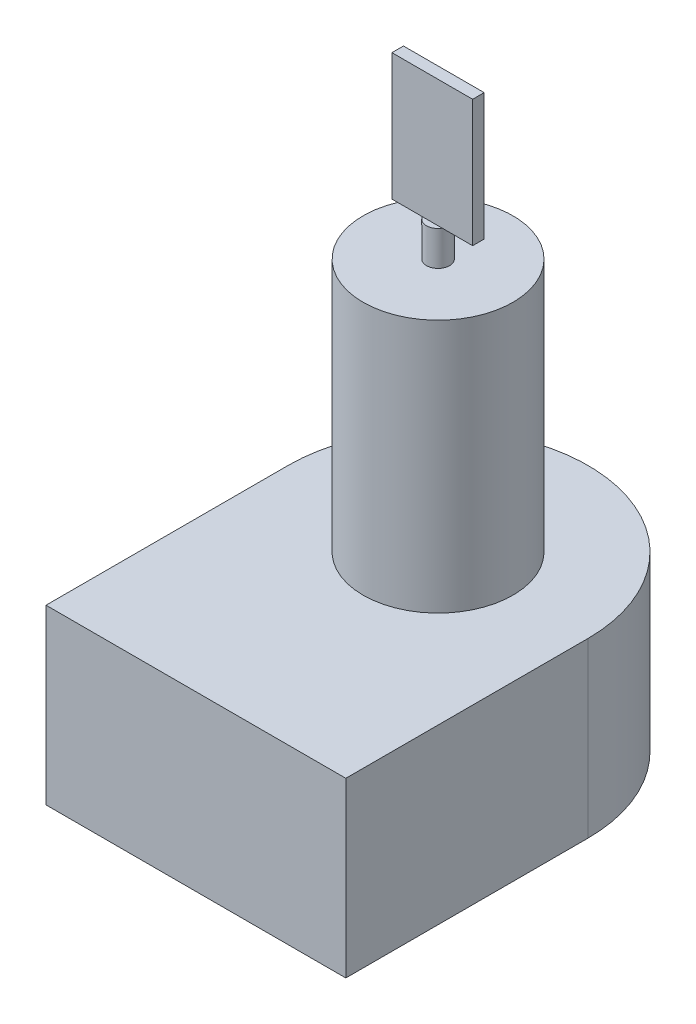
ISO-10303-21;
HEADER;
FILE_DESCRIPTION(('STEP AP214'),'2;1');
FILE_NAME('part.step','',(''),(''),'','','');
FILE_SCHEMA(('AUTOMOTIVE_DESIGN { 1 0 10303 214 1 1 1 1 }'));
ENDSEC;
DATA;
#1=APPLICATION_CONTEXT('core data for automotive mechanical design processes');
#2=APPLICATION_PROTOCOL_DEFINITION('international standard','automotive_design',2000,#1);
#3=PRODUCT_CONTEXT('',#1,'mechanical');
#4=PRODUCT('Part','Part','',(#3));
#5=PRODUCT_RELATED_PRODUCT_CATEGORY('part','',(#4));
#6=PRODUCT_DEFINITION_FORMATION('','',#4);
#7=PRODUCT_DEFINITION_CONTEXT('part definition',#1,'design');
#8=PRODUCT_DEFINITION('design','',#6,#7);
#9=PRODUCT_DEFINITION_SHAPE('','',#8);
#10=(LENGTH_UNIT() NAMED_UNIT(*) SI_UNIT(.MILLI.,.METRE.));
#11=(NAMED_UNIT(*) PLANE_ANGLE_UNIT() SI_UNIT($,.RADIAN.));
#12=(NAMED_UNIT(*) SI_UNIT($,.STERADIAN.) SOLID_ANGLE_UNIT());
#13=UNCERTAINTY_MEASURE_WITH_UNIT(LENGTH_MEASURE(1.E-05),#10,'distance_accuracy_value','');
#14=(GEOMETRIC_REPRESENTATION_CONTEXT(3) GLOBAL_UNCERTAINTY_ASSIGNED_CONTEXT((#13)) GLOBAL_UNIT_ASSIGNED_CONTEXT((#10,
#11,#12)) REPRESENTATION_CONTEXT('',''));
#15=CARTESIAN_POINT('',(0.,0.,0.));
#16=DIRECTION('',(0.,0.,1.));
#17=DIRECTION('',(1.,0.,0.));
#18=AXIS2_PLACEMENT_3D('',#15,#16,#17);
#19=CARTESIAN_POINT('',(0.,40.,0.));
#20=DIRECTION('',(0.,1.,0.));
#21=DIRECTION('',(0.,0.,1.));
#22=AXIS2_PLACEMENT_3D('',#19,#20,#21);
#23=PLANE('',#22);
#24=DIRECTION('',(1.,0.,0.));
#25=VECTOR('',#24,1.);
#26=CARTESIAN_POINT('',(-3.5,40.,0.5));
#27=LINE('',#26,#25);
#28=CARTESIAN_POINT('',(-0.866025403784439,40.,0.5));
#29=VERTEX_POINT('',#28);
#30=CARTESIAN_POINT('',(0.866025403784439,40.,0.5));
#31=VERTEX_POINT('',#30);
#32=EDGE_CURVE('E11',#29,#31,#27,.T.);
#33=ORIENTED_EDGE('',*,*,#32,.F.);
#34=CARTESIAN_POINT('',(0.,40.,0.));
#35=DIRECTION('',(0.,1.,0.));
#36=DIRECTION('',(0.,0.,1.));
#37=AXIS2_PLACEMENT_3D('',#34,#35,#36);
#38=CIRCLE('',#37,1.);
#39=EDGE_CURVE('E141',#29,#31,#38,.T.);
#40=ORIENTED_EDGE('',*,*,#39,.T.);
#41=EDGE_LOOP('',(#33,#40));
#42=FACE_BOUND('',#41,.T.);
#43=ADVANCED_FACE('F38',(#42),#23,.T.);
#44=CARTESIAN_POINT('',(0.,15.,0.));
#45=DIRECTION('',(0.,-1.,0.));
#46=DIRECTION('',(0.,0.,-1.));
#47=AXIS2_PLACEMENT_3D('',#44,#45,#46);
#48=CYLINDRICAL_SURFACE('',#47,13.);
#49=CARTESIAN_POINT('',(0.,0.,0.));
#50=DIRECTION('',(0.,1.,0.));
#51=DIRECTION('',(0.,0.,1.));
#52=AXIS2_PLACEMENT_3D('',#49,#50,#51);
#53=CIRCLE('',#52,13.);
#54=CARTESIAN_POINT('',(13.,0.,0.));
#55=VERTEX_POINT('',#54);
#56=CARTESIAN_POINT('',(-13.,0.,0.));
#57=VERTEX_POINT('',#56);
#58=EDGE_CURVE('E159',#55,#57,#53,.T.);
#59=ORIENTED_EDGE('',*,*,#58,.T.);
#60=DIRECTION('',(0.,-1.,0.));
#61=VECTOR('',#60,1.);
#62=CARTESIAN_POINT('',(-13.,15.,0.));
#63=LINE('',#62,#61);
#64=CARTESIAN_POINT('',(-13.,15.,0.));
#65=VERTEX_POINT('',#64);
#66=EDGE_CURVE('E42',#65,#57,#63,.T.);
#67=ORIENTED_EDGE('',*,*,#66,.F.);
#68=CARTESIAN_POINT('',(0.,15.,0.));
#69=DIRECTION('',(0.,1.,0.));
#70=DIRECTION('',(0.,0.,1.));
#71=AXIS2_PLACEMENT_3D('',#68,#69,#70);
#72=CIRCLE('',#71,13.);
#73=CARTESIAN_POINT('',(13.,15.,0.));
#74=VERTEX_POINT('',#73);
#75=EDGE_CURVE('E162',#74,#65,#72,.T.);
#76=ORIENTED_EDGE('',*,*,#75,.F.);
#77=DIRECTION('',(0.,-1.,0.));
#78=VECTOR('',#77,1.);
#79=CARTESIAN_POINT('',(13.,15.,0.));
#80=LINE('',#79,#78);
#81=EDGE_CURVE('E172',#74,#55,#80,.T.);
#82=ORIENTED_EDGE('',*,*,#81,.T.);
#83=EDGE_LOOP('',(#59,#67,#76,#82));
#84=FACE_BOUND('',#83,.T.);
#85=ADVANCED_FACE('F40',(#84),#48,.T.);
#86=CARTESIAN_POINT('',(-13.,15.,0.));
#87=DIRECTION('',(1.,0.,0.));
#88=DIRECTION('',(0.,0.,-1.));
#89=AXIS2_PLACEMENT_3D('',#86,#87,#88);
#90=PLANE('',#89);
#91=DIRECTION('',(0.,0.,1.));
#92=VECTOR('',#91,1.);
#93=CARTESIAN_POINT('',(-13.,0.,0.));
#94=LINE('',#93,#92);
#95=CARTESIAN_POINT('',(-13.,0.,21.));
#96=VERTEX_POINT('',#95);
#97=EDGE_CURVE('E175',#57,#96,#94,.T.);
#98=ORIENTED_EDGE('',*,*,#97,.T.);
#99=DIRECTION('',(0.,-1.,0.));
#100=VECTOR('',#99,1.);
#101=CARTESIAN_POINT('',(-13.,15.,21.));
#102=LINE('',#101,#100);
#103=CARTESIAN_POINT('',(-13.,15.,21.));
#104=VERTEX_POINT('',#103);
#105=EDGE_CURVE('E184',#104,#96,#102,.T.);
#106=ORIENTED_EDGE('',*,*,#105,.F.);
#107=DIRECTION('',(0.,0.,1.));
#108=VECTOR('',#107,1.);
#109=CARTESIAN_POINT('',(-13.,15.,0.));
#110=LINE('',#109,#108);
#111=EDGE_CURVE('E165',#65,#104,#110,.T.);
#112=ORIENTED_EDGE('',*,*,#111,.F.);
#113=ORIENTED_EDGE('',*,*,#66,.T.);
#114=EDGE_LOOP('',(#98,#106,#112,#113));
#115=FACE_BOUND('',#114,.T.);
#116=ADVANCED_FACE('F193',(#115),#90,.F.);
#117=CARTESIAN_POINT('',(-13.,15.,21.));
#118=DIRECTION('',(0.,0.,-1.));
#119=DIRECTION('',(-1.,0.,0.));
#120=AXIS2_PLACEMENT_3D('',#117,#118,#119);
#121=PLANE('',#120);
#122=DIRECTION('',(1.,0.,0.));
#123=VECTOR('',#122,1.);
#124=CARTESIAN_POINT('',(-13.,0.,21.));
#125=LINE('',#124,#123);
#126=CARTESIAN_POINT('',(13.,0.,21.));
#127=VERTEX_POINT('',#126);
#128=EDGE_CURVE('E177',#96,#127,#125,.T.);
#129=ORIENTED_EDGE('',*,*,#128,.T.);
#130=DIRECTION('',(0.,-1.,0.));
#131=VECTOR('',#130,1.);
#132=CARTESIAN_POINT('',(13.,15.,21.));
#133=LINE('',#132,#131);
#134=CARTESIAN_POINT('',(13.,15.,21.));
#135=VERTEX_POINT('',#134);
#136=EDGE_CURVE('E182',#135,#127,#133,.T.);
#137=ORIENTED_EDGE('',*,*,#136,.F.);
#138=DIRECTION('',(1.,0.,0.));
#139=VECTOR('',#138,1.);
#140=CARTESIAN_POINT('',(-13.,15.,21.));
#141=LINE('',#140,#139);
#142=EDGE_CURVE('E168',#104,#135,#141,.T.);
#143=ORIENTED_EDGE('',*,*,#142,.F.);
#144=ORIENTED_EDGE('',*,*,#105,.T.);
#145=EDGE_LOOP('',(#129,#137,#143,#144));
#146=FACE_BOUND('',#145,.T.);
#147=ADVANCED_FACE('F202',(#146),#121,.F.);
#148=CARTESIAN_POINT('',(13.,15.,21.));
#149=DIRECTION('',(-1.,0.,0.));
#150=DIRECTION('',(0.,0.,1.));
#151=AXIS2_PLACEMENT_3D('',#148,#149,#150);
#152=PLANE('',#151);
#153=DIRECTION('',(0.,0.,-1.));
#154=VECTOR('',#153,1.);
#155=CARTESIAN_POINT('',(13.,0.,21.));
#156=LINE('',#155,#154);
#157=EDGE_CURVE('E166',#127,#55,#156,.T.);
#158=ORIENTED_EDGE('',*,*,#157,.T.);
#159=ORIENTED_EDGE('',*,*,#81,.F.);
#160=DIRECTION('',(0.,0.,-1.));
#161=VECTOR('',#160,1.);
#162=CARTESIAN_POINT('',(13.,15.,21.));
#163=LINE('',#162,#161);
#164=EDGE_CURVE('E170',#135,#74,#163,.T.);
#165=ORIENTED_EDGE('',*,*,#164,.F.);
#166=ORIENTED_EDGE('',*,*,#136,.T.);
#167=EDGE_LOOP('',(#158,#159,#165,#166));
#168=FACE_BOUND('',#167,.T.);
#169=ADVANCED_FACE('F205',(#168),#152,.F.);
#170=CARTESIAN_POINT('',(0.,15.,0.));
#171=DIRECTION('',(0.,1.,0.));
#172=DIRECTION('',(0.,0.,1.));
#173=AXIS2_PLACEMENT_3D('',#170,#171,#172);
#174=PLANE('',#173);
#175=CARTESIAN_POINT('',(0.,15.,0.));
#176=DIRECTION('',(0.,1.,0.));
#177=DIRECTION('',(0.,0.,1.));
#178=AXIS2_PLACEMENT_3D('',#175,#176,#177);
#179=CIRCLE('',#178,6.5);
#180=CARTESIAN_POINT('',(0.,15.,6.5));
#181=VERTEX_POINT('',#180);
#182=EDGE_CURVE('E156',#181,#181,#179,.T.);
#183=ORIENTED_EDGE('',*,*,#182,.F.);
#184=EDGE_LOOP('',(#183));
#185=FACE_BOUND('',#184,.T.);
#186=ORIENTED_EDGE('',*,*,#75,.T.);
#187=ORIENTED_EDGE('',*,*,#111,.T.);
#188=ORIENTED_EDGE('',*,*,#142,.T.);
#189=ORIENTED_EDGE('',*,*,#164,.T.);
#190=EDGE_LOOP('',(#186,#187,#188,#189));
#191=FACE_BOUND('',#190,.T.);
#192=ADVANCED_FACE('F207',(#185,#191),#174,.T.);
#193=CARTESIAN_POINT('',(0.,0.,0.));
#194=DIRECTION('',(0.,1.,0.));
#195=DIRECTION('',(0.,0.,1.));
#196=AXIS2_PLACEMENT_3D('',#193,#194,#195);
#197=PLANE('',#196);
#198=ORIENTED_EDGE('',*,*,#58,.F.);
#199=ORIENTED_EDGE('',*,*,#157,.F.);
#200=ORIENTED_EDGE('',*,*,#128,.F.);
#201=ORIENTED_EDGE('',*,*,#97,.F.);
#202=EDGE_LOOP('',(#198,#199,#200,#201));
#203=FACE_BOUND('',#202,.T.);
#204=ADVANCED_FACE('F200',(#203),#197,.F.);
#205=CARTESIAN_POINT('',(0.,37.,0.));
#206=DIRECTION('',(0.,-1.,0.));
#207=DIRECTION('',(0.,0.,-1.));
#208=AXIS2_PLACEMENT_3D('',#205,#206,#207);
#209=CYLINDRICAL_SURFACE('',#208,6.5);
#210=CARTESIAN_POINT('',(0.,37.,0.));
#211=DIRECTION('',(0.,1.,0.));
#212=DIRECTION('',(0.,0.,1.));
#213=AXIS2_PLACEMENT_3D('',#210,#211,#212);
#214=CIRCLE('',#213,6.5);
#215=CARTESIAN_POINT('',(0.,37.,6.5));
#216=VERTEX_POINT('',#215);
#217=EDGE_CURVE('E151',#216,#216,#214,.T.);
#218=ORIENTED_EDGE('',*,*,#217,.F.);
#219=EDGE_LOOP('',(#218));
#220=FACE_BOUND('',#219,.T.);
#221=ORIENTED_EDGE('',*,*,#182,.T.);
#222=EDGE_LOOP('',(#221));
#223=FACE_BOUND('',#222,.T.);
#224=ADVANCED_FACE('F215',(#220,#223),#209,.T.);
#225=CARTESIAN_POINT('',(0.,37.,0.));
#226=DIRECTION('',(0.,1.,0.));
#227=DIRECTION('',(0.,0.,1.));
#228=AXIS2_PLACEMENT_3D('',#225,#226,#227);
#229=PLANE('',#228);
#230=CARTESIAN_POINT('',(0.,37.,0.));
#231=DIRECTION('',(0.,1.,0.));
#232=DIRECTION('',(0.,0.,1.));
#233=AXIS2_PLACEMENT_3D('',#230,#231,#232);
#234=CIRCLE('',#233,1.);
#235=CARTESIAN_POINT('',(0.,37.,1.));
#236=VERTEX_POINT('',#235);
#237=EDGE_CURVE('E153',#236,#236,#234,.T.);
#238=ORIENTED_EDGE('',*,*,#237,.F.);
#239=EDGE_LOOP('',(#238));
#240=FACE_BOUND('',#239,.T.);
#241=ORIENTED_EDGE('',*,*,#217,.T.);
#242=EDGE_LOOP('',(#241));
#243=FACE_BOUND('',#242,.T.);
#244=ADVANCED_FACE('F238',(#240,#243),#229,.T.);
#245=CARTESIAN_POINT('',(0.,40.,0.));
#246=DIRECTION('',(0.,-1.,0.));
#247=DIRECTION('',(0.,0.,-1.));
#248=AXIS2_PLACEMENT_3D('',#245,#246,#247);
#249=CYLINDRICAL_SURFACE('',#248,1.);
#250=CARTESIAN_POINT('',(0.866025403784439,40.,-0.5));
#251=VERTEX_POINT('',#250);
#252=EDGE_CURVE('E145',#31,#251,#38,.T.);
#253=ORIENTED_EDGE('',*,*,#252,.F.);
#254=ORIENTED_EDGE('',*,*,#39,.F.);
#255=CARTESIAN_POINT('',(-0.866025403784439,40.,-0.5));
#256=VERTEX_POINT('',#255);
#257=EDGE_CURVE('E143',#256,#29,#38,.T.);
#258=ORIENTED_EDGE('',*,*,#257,.F.);
#259=EDGE_CURVE('E152',#251,#256,#38,.T.);
#260=ORIENTED_EDGE('',*,*,#259,.F.);
#261=EDGE_LOOP('',(#253,#254,#258,#260));
#262=FACE_BOUND('',#261,.T.);
#263=ORIENTED_EDGE('',*,*,#237,.T.);
#264=EDGE_LOOP('',(#263));
#265=FACE_BOUND('',#264,.T.);
#266=ADVANCED_FACE('F230',(#262,#265),#249,.T.);
#267=DIRECTION('',(-1.,0.,0.));
#268=VECTOR('',#267,1.);
#269=CARTESIAN_POINT('',(-3.5,40.,-0.5));
#270=LINE('',#269,#268);
#271=EDGE_CURVE('E47',#251,#256,#270,.T.);
#272=ORIENTED_EDGE('',*,*,#271,.F.);
#273=ORIENTED_EDGE('',*,*,#259,.T.);
#274=EDGE_LOOP('',(#272,#273));
#275=FACE_BOUND('',#274,.T.);
#276=ADVANCED_FACE('F222',(#275),#23,.T.);
#277=CARTESIAN_POINT('',(0.,40.,0.));
#278=DIRECTION('',(0.,1.,0.));
#279=DIRECTION('',(0.,0.,1.));
#280=AXIS2_PLACEMENT_3D('',#277,#278,#279);
#281=PLANE('',#280);
#282=CARTESIAN_POINT('',(3.5,40.,0.5));
#283=VERTEX_POINT('',#282);
#284=EDGE_CURVE('E50',#31,#283,#27,.T.);
#285=ORIENTED_EDGE('',*,*,#284,.F.);
#286=ORIENTED_EDGE('',*,*,#252,.T.);
#287=CARTESIAN_POINT('',(3.5,40.,-0.5));
#288=VERTEX_POINT('',#287);
#289=EDGE_CURVE('E348',#288,#251,#270,.T.);
#290=ORIENTED_EDGE('',*,*,#289,.F.);
#291=DIRECTION('',(0.,0.,-1.));
#292=VECTOR('',#291,1.);
#293=CARTESIAN_POINT('',(3.5,40.,-0.5));
#294=LINE('',#293,#292);
#295=EDGE_CURVE('E140',#283,#288,#294,.T.);
#296=ORIENTED_EDGE('',*,*,#295,.F.);
#297=EDGE_LOOP('',(#285,#286,#290,#296));
#298=FACE_BOUND('',#297,.T.);
#299=ADVANCED_FACE('F229',(#298),#281,.F.);
#300=CARTESIAN_POINT('',(-3.5,40.,-0.5));
#301=VERTEX_POINT('',#300);
#302=EDGE_CURVE('E347',#256,#301,#270,.T.);
#303=ORIENTED_EDGE('',*,*,#302,.F.);
#304=ORIENTED_EDGE('',*,*,#257,.T.);
#305=CARTESIAN_POINT('',(-3.5,40.,0.5));
#306=VERTEX_POINT('',#305);
#307=EDGE_CURVE('E49',#306,#29,#27,.T.);
#308=ORIENTED_EDGE('',*,*,#307,.F.);
#309=DIRECTION('',(0.,0.,1.));
#310=VECTOR('',#309,1.);
#311=CARTESIAN_POINT('',(-3.5,40.,-0.5));
#312=LINE('',#311,#310);
#313=EDGE_CURVE('E339',#301,#306,#312,.T.);
#314=ORIENTED_EDGE('',*,*,#313,.F.);
#315=EDGE_LOOP('',(#303,#304,#308,#314));
#316=FACE_BOUND('',#315,.T.);
#317=ADVANCED_FACE('F235',(#316),#281,.F.);
#318=CARTESIAN_POINT('',(3.5,51.,-0.5));
#319=DIRECTION('',(-1.,0.,0.));
#320=DIRECTION('',(0.,0.,1.));
#321=AXIS2_PLACEMENT_3D('',#318,#319,#320);
#322=PLANE('',#321);
#323=ORIENTED_EDGE('',*,*,#295,.T.);
#324=DIRECTION('',(0.,-1.,0.));
#325=VECTOR('',#324,1.);
#326=CARTESIAN_POINT('',(3.5,51.,-0.5));
#327=LINE('',#326,#325);
#328=CARTESIAN_POINT('',(3.5,51.,-0.5));
#329=VERTEX_POINT('',#328);
#330=EDGE_CURVE('E121',#329,#288,#327,.T.);
#331=ORIENTED_EDGE('',*,*,#330,.F.);
#332=DIRECTION('',(0.,0.,-1.));
#333=VECTOR('',#332,1.);
#334=CARTESIAN_POINT('',(3.5,51.,-0.5));
#335=LINE('',#334,#333);
#336=CARTESIAN_POINT('',(3.5,51.,0.5));
#337=VERTEX_POINT('',#336);
#338=EDGE_CURVE('E128',#337,#329,#335,.T.);
#339=ORIENTED_EDGE('',*,*,#338,.F.);
#340=DIRECTION('',(0.,-1.,0.));
#341=VECTOR('',#340,1.);
#342=CARTESIAN_POINT('',(3.5,51.,0.5));
#343=LINE('',#342,#341);
#344=EDGE_CURVE('E343',#337,#283,#343,.T.);
#345=ORIENTED_EDGE('',*,*,#344,.T.);
#346=EDGE_LOOP('',(#323,#331,#339,#345));
#347=FACE_BOUND('',#346,.T.);
#348=ADVANCED_FACE('F138',(#347),#322,.F.);
#349=CARTESIAN_POINT('',(-3.5,51.,-0.5));
#350=DIRECTION('',(0.,0.,1.));
#351=DIRECTION('',(1.,0.,0.));
#352=AXIS2_PLACEMENT_3D('',#349,#350,#351);
#353=PLANE('',#352);
#354=ORIENTED_EDGE('',*,*,#289,.T.);
#355=ORIENTED_EDGE('',*,*,#271,.T.);
#356=ORIENTED_EDGE('',*,*,#302,.T.);
#357=DIRECTION('',(0.,-1.,0.));
#358=VECTOR('',#357,1.);
#359=CARTESIAN_POINT('',(-3.5,51.,-0.5));
#360=LINE('',#359,#358);
#361=CARTESIAN_POINT('',(-3.5,51.,-0.5));
#362=VERTEX_POINT('',#361);
#363=EDGE_CURVE('E124',#362,#301,#360,.T.);
#364=ORIENTED_EDGE('',*,*,#363,.F.);
#365=DIRECTION('',(-1.,0.,0.));
#366=VECTOR('',#365,1.);
#367=CARTESIAN_POINT('',(-3.5,51.,-0.5));
#368=LINE('',#367,#366);
#369=EDGE_CURVE('E116',#329,#362,#368,.T.);
#370=ORIENTED_EDGE('',*,*,#369,.F.);
#371=ORIENTED_EDGE('',*,*,#330,.T.);
#372=EDGE_LOOP('',(#354,#355,#356,#364,#370,#371));
#373=FACE_BOUND('',#372,.T.);
#374=ADVANCED_FACE('F119',(#373),#353,.F.);
#375=CARTESIAN_POINT('',(-3.5,51.,-0.5));
#376=DIRECTION('',(1.,0.,0.));
#377=DIRECTION('',(0.,0.,-1.));
#378=AXIS2_PLACEMENT_3D('',#375,#376,#377);
#379=PLANE('',#378);
#380=ORIENTED_EDGE('',*,*,#313,.T.);
#381=DIRECTION('',(0.,-1.,0.));
#382=VECTOR('',#381,1.);
#383=CARTESIAN_POINT('',(-3.5,51.,0.5));
#384=LINE('',#383,#382);
#385=CARTESIAN_POINT('',(-3.5,51.,0.5));
#386=VERTEX_POINT('',#385);
#387=EDGE_CURVE('E146',#386,#306,#384,.T.);
#388=ORIENTED_EDGE('',*,*,#387,.F.);
#389=DIRECTION('',(0.,0.,1.));
#390=VECTOR('',#389,1.);
#391=CARTESIAN_POINT('',(-3.5,51.,-0.5));
#392=LINE('',#391,#390);
#393=EDGE_CURVE('E127',#362,#386,#392,.T.);
#394=ORIENTED_EDGE('',*,*,#393,.F.);
#395=ORIENTED_EDGE('',*,*,#363,.T.);
#396=EDGE_LOOP('',(#380,#388,#394,#395));
#397=FACE_BOUND('',#396,.T.);
#398=ADVANCED_FACE('F302',(#397),#379,.F.);
#399=CARTESIAN_POINT('',(-3.5,51.,0.5));
#400=DIRECTION('',(0.,0.,-1.));
#401=DIRECTION('',(-1.,0.,0.));
#402=AXIS2_PLACEMENT_3D('',#399,#400,#401);
#403=PLANE('',#402);
#404=ORIENTED_EDGE('',*,*,#307,.T.);
#405=ORIENTED_EDGE('',*,*,#32,.T.);
#406=ORIENTED_EDGE('',*,*,#284,.T.);
#407=ORIENTED_EDGE('',*,*,#344,.F.);
#408=DIRECTION('',(1.,0.,0.));
#409=VECTOR('',#408,1.);
#410=CARTESIAN_POINT('',(-3.5,51.,0.5));
#411=LINE('',#410,#409);
#412=EDGE_CURVE('E133',#386,#337,#411,.T.);
#413=ORIENTED_EDGE('',*,*,#412,.F.);
#414=ORIENTED_EDGE('',*,*,#387,.T.);
#415=EDGE_LOOP('',(#404,#405,#406,#407,#413,#414));
#416=FACE_BOUND('',#415,.T.);
#417=ADVANCED_FACE('F311',(#416),#403,.F.);
#418=CARTESIAN_POINT('',(0.,51.,0.));
#419=DIRECTION('',(0.,1.,0.));
#420=DIRECTION('',(0.,0.,1.));
#421=AXIS2_PLACEMENT_3D('',#418,#419,#420);
#422=PLANE('',#421);
#423=ORIENTED_EDGE('',*,*,#338,.T.);
#424=ORIENTED_EDGE('',*,*,#369,.T.);
#425=ORIENTED_EDGE('',*,*,#393,.T.);
#426=ORIENTED_EDGE('',*,*,#412,.T.);
#427=EDGE_LOOP('',(#423,#424,#425,#426));
#428=FACE_BOUND('',#427,.T.);
#429=ADVANCED_FACE('F131',(#428),#422,.T.);
#430=CLOSED_SHELL('',(#43,#85,#116,#147,#169,#192,#204,#224,#244,#266,#276,#299,#317,#348,#374,
#398,#417,#429));
#431=MANIFOLD_SOLID_BREP('B2',#430);
#432=ADVANCED_BREP_SHAPE_REPRESENTATION('',(#18,#431),#14);
#433=SHAPE_DEFINITION_REPRESENTATION(#9,#432);
ENDSEC;
END-ISO-10303-21;
